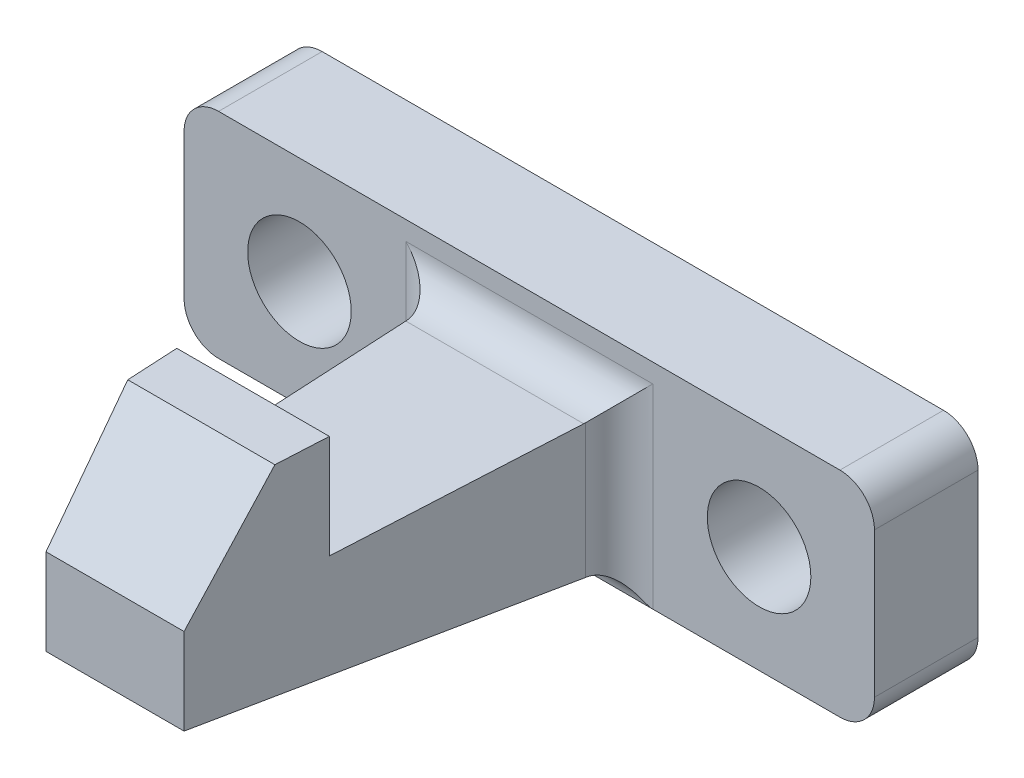
ISO-10303-21;
HEADER;
FILE_DESCRIPTION(('STEP AP214'),'2;1');
FILE_NAME('part.step','',(''),(''),'','','');
FILE_SCHEMA(('AUTOMOTIVE_DESIGN { 1 0 10303 214 1 1 1 1 }'));
ENDSEC;
DATA;
#1=APPLICATION_CONTEXT('core data for automotive mechanical design processes');
#2=APPLICATION_PROTOCOL_DEFINITION('international standard','automotive_design',2000,#1);
#3=PRODUCT_CONTEXT('',#1,'mechanical');
#4=PRODUCT('Part','Part','',(#3));
#5=PRODUCT_RELATED_PRODUCT_CATEGORY('part','',(#4));
#6=PRODUCT_DEFINITION_FORMATION('','',#4);
#7=PRODUCT_DEFINITION_CONTEXT('part definition',#1,'design');
#8=PRODUCT_DEFINITION('design','',#6,#7);
#9=PRODUCT_DEFINITION_SHAPE('','',#8);
#10=(LENGTH_UNIT() NAMED_UNIT(*) SI_UNIT(.MILLI.,.METRE.));
#11=(NAMED_UNIT(*) PLANE_ANGLE_UNIT() SI_UNIT($,.RADIAN.));
#12=(NAMED_UNIT(*) SI_UNIT($,.STERADIAN.) SOLID_ANGLE_UNIT());
#13=UNCERTAINTY_MEASURE_WITH_UNIT(LENGTH_MEASURE(1.E-05),#10,'distance_accuracy_value','');
#14=(GEOMETRIC_REPRESENTATION_CONTEXT(3) GLOBAL_UNCERTAINTY_ASSIGNED_CONTEXT((#13)) GLOBAL_UNIT_ASSIGNED_CONTEXT((#10,
#11,#12)) REPRESENTATION_CONTEXT('',''));
#15=CARTESIAN_POINT('',(0.,0.,0.));
#16=DIRECTION('',(0.,0.,1.));
#17=DIRECTION('',(1.,0.,0.));
#18=AXIS2_PLACEMENT_3D('',#15,#16,#17);
#19=CARTESIAN_POINT('',(10.,3.1,3.));
#20=DIRECTION('',(-1.,0.,0.));
#21=DIRECTION('',(0.,0.,1.));
#22=AXIS2_PLACEMENT_3D('',#19,#20,#21);
#23=PLANE('',#22);
#24=DIRECTION('',(0.,1.,0.));
#25=VECTOR('',#24,1.);
#26=CARTESIAN_POINT('',(10.,3.1,0.));
#27=LINE('',#26,#25);
#28=CARTESIAN_POINT('',(10.,-2.1,0.));
#29=VERTEX_POINT('',#28);
#30=CARTESIAN_POINT('',(10.,2.1,0.));
#31=VERTEX_POINT('',#30);
#32=EDGE_CURVE('E183',#29,#31,#27,.T.);
#33=ORIENTED_EDGE('',*,*,#32,.T.);
#34=DIRECTION('',(0.,0.,-1.));
#35=VECTOR('',#34,1.);
#36=CARTESIAN_POINT('',(10.,2.1,3.));
#37=LINE('',#36,#35);
#38=CARTESIAN_POINT('',(10.,2.1,3.));
#39=VERTEX_POINT('',#38);
#40=EDGE_CURVE('E420',#31,#39,#37,.F.);
#41=ORIENTED_EDGE('',*,*,#40,.T.);
#42=DIRECTION('',(0.,1.,0.));
#43=VECTOR('',#42,1.);
#44=CARTESIAN_POINT('',(10.,3.1,3.));
#45=LINE('',#44,#43);
#46=CARTESIAN_POINT('',(10.,-2.1,3.));
#47=VERTEX_POINT('',#46);
#48=EDGE_CURVE('E215',#47,#39,#45,.T.);
#49=ORIENTED_EDGE('',*,*,#48,.F.);
#50=DIRECTION('',(0.,0.,-1.));
#51=VECTOR('',#50,1.);
#52=CARTESIAN_POINT('',(10.,-2.1,3.));
#53=LINE('',#52,#51);
#54=EDGE_CURVE('E417',#47,#29,#53,.T.);
#55=ORIENTED_EDGE('',*,*,#54,.T.);
#56=EDGE_LOOP('',(#33,#41,#49,#55));
#57=FACE_BOUND('',#56,.T.);
#58=ADVANCED_FACE('F33',(#57),#23,.F.);
#59=CARTESIAN_POINT('',(-10.,3.1,3.));
#60=DIRECTION('',(0.,-1.,0.));
#61=DIRECTION('',(0.,0.,-1.));
#62=AXIS2_PLACEMENT_3D('',#59,#60,#61);
#63=PLANE('',#62);
#64=DIRECTION('',(-1.,0.,0.));
#65=VECTOR('',#64,1.);
#66=CARTESIAN_POINT('',(-10.,3.1,3.));
#67=LINE('',#66,#65);
#68=CARTESIAN_POINT('',(9.,3.1,3.));
#69=VERTEX_POINT('',#68);
#70=CARTESIAN_POINT('',(-9.,3.1,3.));
#71=VERTEX_POINT('',#70);
#72=EDGE_CURVE('E218',#69,#71,#67,.T.);
#73=ORIENTED_EDGE('',*,*,#72,.F.);
#74=DIRECTION('',(0.,0.,-1.));
#75=VECTOR('',#74,1.);
#76=CARTESIAN_POINT('',(9.,3.1,3.));
#77=LINE('',#76,#75);
#78=CARTESIAN_POINT('',(9.,3.1,0.));
#79=VERTEX_POINT('',#78);
#80=EDGE_CURVE('E404',#69,#79,#77,.T.);
#81=ORIENTED_EDGE('',*,*,#80,.T.);
#82=DIRECTION('',(-1.,0.,0.));
#83=VECTOR('',#82,1.);
#84=CARTESIAN_POINT('',(-10.,3.1,0.));
#85=LINE('',#84,#83);
#86=CARTESIAN_POINT('',(-9.,3.1,0.));
#87=VERTEX_POINT('',#86);
#88=EDGE_CURVE('E231',#79,#87,#85,.T.);
#89=ORIENTED_EDGE('',*,*,#88,.T.);
#90=DIRECTION('',(0.,0.,-1.));
#91=VECTOR('',#90,1.);
#92=CARTESIAN_POINT('',(-9.,3.1,3.));
#93=LINE('',#92,#91);
#94=EDGE_CURVE('E262',#87,#71,#93,.F.);
#95=ORIENTED_EDGE('',*,*,#94,.T.);
#96=EDGE_LOOP('',(#73,#81,#89,#95));
#97=FACE_BOUND('',#96,.T.);
#98=ADVANCED_FACE('F311',(#97),#63,.F.);
#99=CARTESIAN_POINT('',(-10.,3.1,3.));
#100=DIRECTION('',(1.,0.,0.));
#101=DIRECTION('',(0.,0.,-1.));
#102=AXIS2_PLACEMENT_3D('',#99,#100,#101);
#103=PLANE('',#102);
#104=DIRECTION('',(0.,-1.,0.));
#105=VECTOR('',#104,1.);
#106=CARTESIAN_POINT('',(-10.,3.1,0.));
#107=LINE('',#106,#105);
#108=CARTESIAN_POINT('',(-10.,2.1,0.));
#109=VERTEX_POINT('',#108);
#110=CARTESIAN_POINT('',(-10.,-2.1,0.));
#111=VERTEX_POINT('',#110);
#112=EDGE_CURVE('E234',#109,#111,#107,.T.);
#113=ORIENTED_EDGE('',*,*,#112,.T.);
#114=DIRECTION('',(0.,0.,-1.));
#115=VECTOR('',#114,1.);
#116=CARTESIAN_POINT('',(-10.,-2.1,3.));
#117=LINE('',#116,#115);
#118=CARTESIAN_POINT('',(-10.,-2.1,3.));
#119=VERTEX_POINT('',#118);
#120=EDGE_CURVE('E11',#111,#119,#117,.F.);
#121=ORIENTED_EDGE('',*,*,#120,.T.);
#122=DIRECTION('',(0.,-1.,0.));
#123=VECTOR('',#122,1.);
#124=CARTESIAN_POINT('',(-10.,3.1,3.));
#125=LINE('',#124,#123);
#126=CARTESIAN_POINT('',(-10.,2.1,3.));
#127=VERTEX_POINT('',#126);
#128=EDGE_CURVE('E222',#127,#119,#125,.T.);
#129=ORIENTED_EDGE('',*,*,#128,.F.);
#130=DIRECTION('',(0.,0.,-1.));
#131=VECTOR('',#130,1.);
#132=CARTESIAN_POINT('',(-10.,2.1,3.));
#133=LINE('',#132,#131);
#134=EDGE_CURVE('E41',#127,#109,#133,.T.);
#135=ORIENTED_EDGE('',*,*,#134,.T.);
#136=EDGE_LOOP('',(#113,#121,#129,#135));
#137=FACE_BOUND('',#136,.T.);
#138=ADVANCED_FACE('F317',(#137),#103,.F.);
#139=CARTESIAN_POINT('',(-10.,-3.1,3.));
#140=DIRECTION('',(0.,1.,0.));
#141=DIRECTION('',(0.,0.,1.));
#142=AXIS2_PLACEMENT_3D('',#139,#140,#141);
#143=PLANE('',#142);
#144=DIRECTION('',(1.,0.,0.));
#145=VECTOR('',#144,1.);
#146=CARTESIAN_POINT('',(-10.,-3.1,0.));
#147=LINE('',#146,#145);
#148=CARTESIAN_POINT('',(-9.,-3.1,0.));
#149=VERTEX_POINT('',#148);
#150=CARTESIAN_POINT('',(9.,-3.1,0.));
#151=VERTEX_POINT('',#150);
#152=EDGE_CURVE('E219',#149,#151,#147,.T.);
#153=ORIENTED_EDGE('',*,*,#152,.T.);
#154=DIRECTION('',(0.,0.,-1.));
#155=VECTOR('',#154,1.);
#156=CARTESIAN_POINT('',(9.,-3.1,3.));
#157=LINE('',#156,#155);
#158=CARTESIAN_POINT('',(9.,-3.1,3.));
#159=VERTEX_POINT('',#158);
#160=EDGE_CURVE('E431',#151,#159,#157,.F.);
#161=ORIENTED_EDGE('',*,*,#160,.T.);
#162=DIRECTION('',(1.,0.,0.));
#163=VECTOR('',#162,1.);
#164=CARTESIAN_POINT('',(-10.,-3.1,3.));
#165=LINE('',#164,#163);
#166=CARTESIAN_POINT('',(3.57785791811138,-3.1,3.));
#167=VERTEX_POINT('',#166);
#168=EDGE_CURVE('E224',#167,#159,#165,.T.);
#169=ORIENTED_EDGE('',*,*,#168,.F.);
#170=CARTESIAN_POINT('',(-3.57785791811137,-3.1,3.));
#171=VERTEX_POINT('',#170);
#172=EDGE_CURVE('E228',#171,#167,#165,.T.);
#173=ORIENTED_EDGE('',*,*,#172,.F.);
#174=CARTESIAN_POINT('',(-9.,-3.1,3.));
#175=VERTEX_POINT('',#174);
#176=EDGE_CURVE('E225',#175,#171,#165,.T.);
#177=ORIENTED_EDGE('',*,*,#176,.F.);
#178=DIRECTION('',(0.,0.,-1.));
#179=VECTOR('',#178,1.);
#180=CARTESIAN_POINT('',(-9.,-3.1,3.));
#181=LINE('',#180,#179);
#182=EDGE_CURVE('E428',#175,#149,#181,.T.);
#183=ORIENTED_EDGE('',*,*,#182,.T.);
#184=EDGE_LOOP('',(#153,#161,#169,#173,#177,#183));
#185=FACE_BOUND('',#184,.T.);
#186=ADVANCED_FACE('F435',(#185),#143,.F.);
#187=CARTESIAN_POINT('',(0.,0.,3.));
#188=DIRECTION('',(0.,0.,1.));
#189=DIRECTION('',(1.,0.,0.));
#190=AXIS2_PLACEMENT_3D('',#187,#188,#189);
#191=PLANE('',#190);
#192=CARTESIAN_POINT('',(6.65790951,0.,3.));
#193=DIRECTION('',(0.,0.,-1.));
#194=DIRECTION('',(-1.,0.,0.));
#195=AXIS2_PLACEMENT_3D('',#192,#193,#194);
#196=CIRCLE('',#195,1.5);
#197=CARTESIAN_POINT('',(8.15790951,0.,3.));
#198=VERTEX_POINT('',#197);
#199=EDGE_CURVE('E375',#198,#198,#196,.T.);
#200=ORIENTED_EDGE('',*,*,#199,.T.);
#201=EDGE_LOOP('',(#200));
#202=FACE_BOUND('',#201,.T.);
#203=CARTESIAN_POINT('',(-6.65790951,0.,3.));
#204=DIRECTION('',(0.,0.,1.));
#205=DIRECTION('',(1.,0.,0.));
#206=AXIS2_PLACEMENT_3D('',#203,#204,#205);
#207=CIRCLE('',#206,1.5);
#208=CARTESIAN_POINT('',(-5.15790951,0.,3.));
#209=VERTEX_POINT('',#208);
#210=EDGE_CURVE('E372',#209,#209,#207,.T.);
#211=ORIENTED_EDGE('',*,*,#210,.F.);
#212=EDGE_LOOP('',(#211));
#213=FACE_BOUND('',#212,.T.);
#214=ORIENTED_EDGE('',*,*,#48,.T.);
#215=CARTESIAN_POINT('',(9.,2.1,3.));
#216=DIRECTION('',(0.,0.,1.));
#217=DIRECTION('',(1.,0.,0.));
#218=AXIS2_PLACEMENT_3D('',#215,#216,#217);
#219=CIRCLE('',#218,1.);
#220=EDGE_CURVE('E426',#39,#69,#219,.T.);
#221=ORIENTED_EDGE('',*,*,#220,.T.);
#222=ORIENTED_EDGE('',*,*,#72,.T.);
#223=CARTESIAN_POINT('',(-9.,2.1,3.));
#224=DIRECTION('',(0.,0.,1.));
#225=DIRECTION('',(1.,0.,0.));
#226=AXIS2_PLACEMENT_3D('',#223,#224,#225);
#227=CIRCLE('',#226,1.);
#228=EDGE_CURVE('E408',#71,#127,#227,.T.);
#229=ORIENTED_EDGE('',*,*,#228,.T.);
#230=ORIENTED_EDGE('',*,*,#128,.T.);
#231=CARTESIAN_POINT('',(-9.,-2.1,3.));
#232=DIRECTION('',(0.,0.,1.));
#233=DIRECTION('',(1.,0.,0.));
#234=AXIS2_PLACEMENT_3D('',#231,#232,#233);
#235=CIRCLE('',#234,1.);
#236=EDGE_CURVE('E48',#119,#175,#235,.T.);
#237=ORIENTED_EDGE('',*,*,#236,.T.);
#238=ORIENTED_EDGE('',*,*,#176,.T.);
#239=DIRECTION('',(0.,1.,0.));
#240=VECTOR('',#239,1.);
#241=CARTESIAN_POINT('',(-3.57785791811137,1.55,3.));
#242=LINE('',#241,#240);
#243=CARTESIAN_POINT('',(-3.57785791811137,2.55,3.));
#244=VERTEX_POINT('',#243);
#245=EDGE_CURVE('E227',#171,#244,#242,.T.);
#246=ORIENTED_EDGE('',*,*,#245,.T.);
#247=DIRECTION('',(1.,0.,0.));
#248=VECTOR('',#247,1.);
#249=CARTESIAN_POINT('',(2.62889335139649,2.55,3.));
#250=LINE('',#249,#248);
#251=CARTESIAN_POINT('',(3.57785791811137,2.55,3.));
#252=VERTEX_POINT('',#251);
#253=EDGE_CURVE('E239',#244,#252,#250,.T.);
#254=ORIENTED_EDGE('',*,*,#253,.T.);
#255=DIRECTION('',(0.,-1.,0.));
#256=VECTOR('',#255,1.);
#257=CARTESIAN_POINT('',(3.57785791811137,-2.44999999999998,3.));
#258=LINE('',#257,#256);
#259=EDGE_CURVE('E242',#252,#167,#258,.T.);
#260=ORIENTED_EDGE('',*,*,#259,.T.);
#261=ORIENTED_EDGE('',*,*,#168,.T.);
#262=CARTESIAN_POINT('',(9.,-2.1,3.));
#263=DIRECTION('',(0.,0.,1.));
#264=DIRECTION('',(1.,0.,0.));
#265=AXIS2_PLACEMENT_3D('',#262,#263,#264);
#266=CIRCLE('',#265,1.);
#267=EDGE_CURVE('E424',#159,#47,#266,.T.);
#268=ORIENTED_EDGE('',*,*,#267,.T.);
#269=EDGE_LOOP('',(#214,#221,#222,#229,#230,#237,#238,#246,#254,#260,#261,#268));
#270=FACE_BOUND('',#269,.T.);
#271=ADVANCED_FACE('F346',(#202,#213,#270),#191,.T.);
#272=CARTESIAN_POINT('',(0.,0.,0.));
#273=DIRECTION('',(0.,0.,1.));
#274=DIRECTION('',(1.,0.,0.));
#275=AXIS2_PLACEMENT_3D('',#272,#273,#274);
#276=PLANE('',#275);
#277=CARTESIAN_POINT('',(6.65790951,0.,0.));
#278=DIRECTION('',(0.,0.,1.));
#279=DIRECTION('',(1.,0.,0.));
#280=AXIS2_PLACEMENT_3D('',#277,#278,#279);
#281=CIRCLE('',#280,1.5);
#282=CARTESIAN_POINT('',(8.15790951,0.,0.));
#283=VERTEX_POINT('',#282);
#284=EDGE_CURVE('E376',#283,#283,#281,.T.);
#285=ORIENTED_EDGE('',*,*,#284,.T.);
#286=EDGE_LOOP('',(#285));
#287=FACE_BOUND('',#286,.T.);
#288=CARTESIAN_POINT('',(-6.65790951,0.,0.));
#289=DIRECTION('',(0.,0.,1.));
#290=DIRECTION('',(1.,0.,0.));
#291=AXIS2_PLACEMENT_3D('',#288,#289,#290);
#292=CIRCLE('',#291,1.5);
#293=CARTESIAN_POINT('',(-5.15790951,0.,0.));
#294=VERTEX_POINT('',#293);
#295=EDGE_CURVE('E266',#294,#294,#292,.F.);
#296=ORIENTED_EDGE('',*,*,#295,.F.);
#297=EDGE_LOOP('',(#296));
#298=FACE_BOUND('',#297,.T.);
#299=ORIENTED_EDGE('',*,*,#88,.F.);
#300=CARTESIAN_POINT('',(9.,2.1,0.));
#301=DIRECTION('',(0.,0.,1.));
#302=DIRECTION('',(1.,0.,0.));
#303=AXIS2_PLACEMENT_3D('',#300,#301,#302);
#304=CIRCLE('',#303,1.);
#305=EDGE_CURVE('E397',#79,#31,#304,.F.);
#306=ORIENTED_EDGE('',*,*,#305,.T.);
#307=ORIENTED_EDGE('',*,*,#32,.F.);
#308=CARTESIAN_POINT('',(9.,-2.1,0.));
#309=DIRECTION('',(0.,0.,1.));
#310=DIRECTION('',(1.,0.,0.));
#311=AXIS2_PLACEMENT_3D('',#308,#309,#310);
#312=CIRCLE('',#311,1.);
#313=EDGE_CURVE('E414',#29,#151,#312,.F.);
#314=ORIENTED_EDGE('',*,*,#313,.T.);
#315=ORIENTED_EDGE('',*,*,#152,.F.);
#316=CARTESIAN_POINT('',(-9.,-2.1,0.));
#317=DIRECTION('',(0.,0.,1.));
#318=DIRECTION('',(1.,0.,0.));
#319=AXIS2_PLACEMENT_3D('',#316,#317,#318);
#320=CIRCLE('',#319,1.);
#321=EDGE_CURVE('E412',#149,#111,#320,.F.);
#322=ORIENTED_EDGE('',*,*,#321,.T.);
#323=ORIENTED_EDGE('',*,*,#112,.F.);
#324=CARTESIAN_POINT('',(-9.,2.1,0.));
#325=DIRECTION('',(0.,0.,1.));
#326=DIRECTION('',(1.,0.,0.));
#327=AXIS2_PLACEMENT_3D('',#324,#325,#326);
#328=CIRCLE('',#327,1.);
#329=EDGE_CURVE('E399',#109,#87,#328,.F.);
#330=ORIENTED_EDGE('',*,*,#329,.T.);
#331=EDGE_LOOP('',(#299,#306,#307,#314,#315,#322,#323,#330));
#332=FACE_BOUND('',#331,.T.);
#333=ADVANCED_FACE('F389',(#287,#298,#332),#276,.F.);
#334=CARTESIAN_POINT('',(0.,1.55,-491.));
#335=DIRECTION('',(0.,1.,0.));
#336=DIRECTION('',(1.,0.,0.));
#337=AXIS2_PLACEMENT_3D('',#334,#335,#336);
#338=PLANE('',#337);
#339=DIRECTION('',(0.0523359562429438,0.,-0.998629534754574));
#340=VECTOR('',#339,1.);
#341=CARTESIAN_POINT('',(2.,1.55,15.));
#342=LINE('',#341,#340);
#343=CARTESIAN_POINT('',(2.20963111713216,1.55,11.));
#344=VERTEX_POINT('',#343);
#345=CARTESIAN_POINT('',(2.57648557211345,1.55,3.99999999999999));
#346=VERTEX_POINT('',#345);
#347=EDGE_CURVE('E197',#344,#346,#342,.T.);
#348=ORIENTED_EDGE('',*,*,#347,.T.);
#349=DIRECTION('',(1.,0.,0.));
#350=VECTOR('',#349,1.);
#351=CARTESIAN_POINT('',(-2.62889335139649,1.55,4.));
#352=LINE('',#351,#350);
#353=CARTESIAN_POINT('',(-2.57648557211345,1.55,3.99999999999999));
#354=VERTEX_POINT('',#353);
#355=EDGE_CURVE('E244',#346,#354,#352,.F.);
#356=ORIENTED_EDGE('',*,*,#355,.T.);
#357=DIRECTION('',(0.0523359562429438,0.,0.998629534754574));
#358=VECTOR('',#357,1.);
#359=CARTESIAN_POINT('',(-2.,1.55,15.));
#360=LINE('',#359,#358);
#361=CARTESIAN_POINT('',(-2.20963111713216,1.55,11.));
#362=VERTEX_POINT('',#361);
#363=EDGE_CURVE('E205',#354,#362,#360,.T.);
#364=ORIENTED_EDGE('',*,*,#363,.T.);
#365=DIRECTION('',(1.,0.,0.));
#366=VECTOR('',#365,1.);
#367=CARTESIAN_POINT('',(0.,1.55,11.));
#368=LINE('',#367,#366);
#369=EDGE_CURVE('E180',#362,#344,#368,.T.);
#370=ORIENTED_EDGE('',*,*,#369,.T.);
#371=EDGE_LOOP('',(#348,#356,#364,#370));
#372=FACE_BOUND('',#371,.T.);
#373=ADVANCED_FACE('F334',(#372),#338,.T.);
#374=CARTESIAN_POINT('',(-2.,-0.95,15.));
#375=DIRECTION('',(-0.998629534754574,0.,0.0523359562429438));
#376=DIRECTION('',(-0.0523359562429438,0.,-0.998629534754574));
#377=AXIS2_PLACEMENT_3D('',#374,#375,#376);
#378=PLANE('',#377);
#379=CARTESIAN_POINT('',(-2.57648557211345,2.55,4.));
#380=DIRECTION('',(-0.998629534754574,0.,0.0523359562429438));
#381=DIRECTION('',(-0.0523359562429438,0.,-0.998629534754574));
#382=AXIS2_PLACEMENT_3D('',#379,#380,#381);
#383=ELLIPSE('',#382,1.00137234599792,1.);
#384=CARTESIAN_POINT('',(-2.5792283833568,1.55137046524543,3.94766404375706));
#385=VERTEX_POINT('',#384);
#386=EDGE_CURVE('E255',#354,#385,#383,.F.);
#387=ORIENTED_EDGE('',*,*,#386,.T.);
#388=DIRECTION('',(0.,1.,0.));
#389=VECTOR('',#388,1.);
#390=CARTESIAN_POINT('',(-2.5792283833568,-2.44999999999998,3.94766404375706));
#391=LINE('',#390,#389);
#392=CARTESIAN_POINT('',(-2.5792283833568,-2.33154199453035,3.94766404375706));
#393=VERTEX_POINT('',#392);
#394=EDGE_CURVE('E249',#385,#393,#391,.F.);
#395=ORIENTED_EDGE('',*,*,#394,.T.);
#396=DIRECTION('',(-0.0519329057553304,-0.123867359163544,-0.990938873308368));
#397=VECTOR('',#396,1.);
#398=CARTESIAN_POINT('',(-2.,-0.95,15.));
#399=LINE('',#398,#397);
#400=CARTESIAN_POINT('',(-2.,-0.95,15.));
#401=VERTEX_POINT('',#400);
#402=EDGE_CURVE('E212',#401,#393,#399,.T.);
#403=ORIENTED_EDGE('',*,*,#402,.F.);
#404=DIRECTION('',(0.,1.,0.));
#405=VECTOR('',#404,1.);
#406=CARTESIAN_POINT('',(-2.,-0.95,15.));
#407=LINE('',#406,#405);
#408=CARTESIAN_POINT('',(-2.,1.55,15.));
#409=VERTEX_POINT('',#408);
#410=EDGE_CURVE('E192',#401,#409,#407,.T.);
#411=ORIENTED_EDGE('',*,*,#410,.T.);
#412=DIRECTION('',(0.0335317755777286,-0.767789271817039,0.639824393180867));
#413=VECTOR('',#412,1.);
#414=CARTESIAN_POINT('',(-1.93563665611611,0.0762490852066456,16.2281257623278));
#415=LINE('',#414,#413);
#416=CARTESIAN_POINT('',(-2.1310194482076,4.55,12.5));
#417=VERTEX_POINT('',#416);
#418=EDGE_CURVE('E190',#417,#409,#415,.T.);
#419=ORIENTED_EDGE('',*,*,#418,.F.);
#420=DIRECTION('',(-0.0523359562429438,0.,-0.998629534754574));
#421=VECTOR('',#420,1.);
#422=CARTESIAN_POINT('',(-2.,4.55,15.));
#423=LINE('',#422,#421);
#424=CARTESIAN_POINT('',(-2.20963111713216,4.55,11.));
#425=VERTEX_POINT('',#424);
#426=EDGE_CURVE('E168',#417,#425,#423,.T.);
#427=ORIENTED_EDGE('',*,*,#426,.T.);
#428=DIRECTION('',(0.,1.,0.));
#429=VECTOR('',#428,1.);
#430=CARTESIAN_POINT('',(-2.20963111713216,-0.95,11.));
#431=LINE('',#430,#429);
#432=EDGE_CURVE('E173',#362,#425,#431,.T.);
#433=ORIENTED_EDGE('',*,*,#432,.F.);
#434=ORIENTED_EDGE('',*,*,#363,.F.);
#435=EDGE_LOOP('',(#387,#395,#403,#411,#419,#427,#433,#434));
#436=FACE_BOUND('',#435,.T.);
#437=ADVANCED_FACE('F187',(#436),#378,.T.);
#438=CARTESIAN_POINT('',(0.,-0.95,15.));
#439=DIRECTION('',(0.,0.,1.));
#440=DIRECTION('',(0.,1.,0.));
#441=AXIS2_PLACEMENT_3D('',#438,#439,#440);
#442=PLANE('',#441);
#443=ORIENTED_EDGE('',*,*,#410,.F.);
#444=DIRECTION('',(-1.,0.,0.));
#445=VECTOR('',#444,1.);
#446=CARTESIAN_POINT('',(0.,-0.95,15.));
#447=LINE('',#446,#445);
#448=CARTESIAN_POINT('',(2.,-0.95,15.));
#449=VERTEX_POINT('',#448);
#450=EDGE_CURVE('E211',#449,#401,#447,.T.);
#451=ORIENTED_EDGE('',*,*,#450,.F.);
#452=DIRECTION('',(0.,1.,0.));
#453=VECTOR('',#452,1.);
#454=CARTESIAN_POINT('',(2.,-0.95,15.));
#455=LINE('',#454,#453);
#456=CARTESIAN_POINT('',(2.,1.55,15.));
#457=VERTEX_POINT('',#456);
#458=EDGE_CURVE('E191',#449,#457,#455,.T.);
#459=ORIENTED_EDGE('',*,*,#458,.T.);
#460=DIRECTION('',(1.,0.,0.));
#461=VECTOR('',#460,1.);
#462=CARTESIAN_POINT('',(0.,1.55,15.));
#463=LINE('',#462,#461);
#464=EDGE_CURVE('E361',#409,#457,#463,.T.);
#465=ORIENTED_EDGE('',*,*,#464,.F.);
#466=EDGE_LOOP('',(#443,#451,#459,#465));
#467=FACE_BOUND('',#466,.T.);
#468=ADVANCED_FACE('F359',(#467),#442,.T.);
#469=CARTESIAN_POINT('',(0.,-0.95,15.));
#470=DIRECTION('',(0.,-0.992277876713668,0.124034734589207));
#471=DIRECTION('',(0.,0.124034734589207,0.992277876713668));
#472=AXIS2_PLACEMENT_3D('',#469,#470,#471);
#473=PLANE('',#472);
#474=CARTESIAN_POINT('',(-3.57785791811137,-2.32499999999998,4.));
#475=DIRECTION('',(0.,-0.992277876713668,0.124034734589207));
#476=DIRECTION('',(0.,-0.124034734589207,-0.992277876713668));
#477=AXIS2_PLACEMENT_3D('',#474,#475,#476);
#478=ELLIPSE('',#477,1.00778221853732,1.);
#479=CARTESIAN_POINT('',(-2.58953287886823,-2.34404501936408,3.84763984508725));
#480=VERTEX_POINT('',#479);
#481=EDGE_CURVE('E259',#393,#480,#478,.F.);
#482=ORIENTED_EDGE('',*,*,#481,.T.);
#483=DIRECTION('',(1.,0.,0.));
#484=VECTOR('',#483,1.);
#485=CARTESIAN_POINT('',(2.62889335139649,-2.34404501936408,3.84763984508725));
#486=LINE('',#485,#484);
#487=CARTESIAN_POINT('',(2.58953287886823,-2.34404501936408,3.84763984508725));
#488=VERTEX_POINT('',#487);
#489=EDGE_CURVE('E251',#480,#488,#486,.T.);
#490=ORIENTED_EDGE('',*,*,#489,.T.);
#491=CARTESIAN_POINT('',(3.57785791811137,-2.32499999999998,4.));
#492=DIRECTION('',(0.,-0.992277876713668,0.124034734589207));
#493=DIRECTION('',(0.,0.124034734589207,0.992277876713668));
#494=AXIS2_PLACEMENT_3D('',#491,#492,#493);
#495=ELLIPSE('',#494,1.00778221853732,1.);
#496=CARTESIAN_POINT('',(2.5792283833568,-2.33154199453035,3.94766404375706));
#497=VERTEX_POINT('',#496);
#498=EDGE_CURVE('E257',#488,#497,#495,.F.);
#499=ORIENTED_EDGE('',*,*,#498,.T.);
#500=DIRECTION('',(-0.0519329057553304,0.123867359163544,0.990938873308368));
#501=VECTOR('',#500,1.);
#502=CARTESIAN_POINT('',(2.,-0.95,15.));
#503=LINE('',#502,#501);
#504=EDGE_CURVE('E195',#497,#449,#503,.T.);
#505=ORIENTED_EDGE('',*,*,#504,.T.);
#506=ORIENTED_EDGE('',*,*,#450,.T.);
#507=ORIENTED_EDGE('',*,*,#402,.T.);
#508=EDGE_LOOP('',(#482,#490,#499,#505,#506,#507));
#509=FACE_BOUND('',#508,.T.);
#510=ADVANCED_FACE('F353',(#509),#473,.T.);
#511=CARTESIAN_POINT('',(2.,-0.95,15.));
#512=DIRECTION('',(0.998629534754574,0.,0.0523359562429438));
#513=DIRECTION('',(-0.0523359562429438,0.,0.998629534754574));
#514=AXIS2_PLACEMENT_3D('',#511,#512,#513);
#515=PLANE('',#514);
#516=ORIENTED_EDGE('',*,*,#504,.F.);
#517=DIRECTION('',(0.,-1.,0.));
#518=VECTOR('',#517,1.);
#519=CARTESIAN_POINT('',(2.5792283833568,1.55,3.94766404375706));
#520=LINE('',#519,#518);
#521=CARTESIAN_POINT('',(2.5792283833568,1.55137046524543,3.94766404375706));
#522=VERTEX_POINT('',#521);
#523=EDGE_CURVE('E247',#497,#522,#520,.F.);
#524=ORIENTED_EDGE('',*,*,#523,.T.);
#525=CARTESIAN_POINT('',(2.57648557211345,2.55,4.));
#526=DIRECTION('',(0.998629534754574,0.,0.0523359562429438));
#527=DIRECTION('',(-0.0523359562429438,0.,0.998629534754574));
#528=AXIS2_PLACEMENT_3D('',#525,#526,#527);
#529=ELLIPSE('',#528,1.00137234599792,1.);
#530=EDGE_CURVE('E253',#522,#346,#529,.F.);
#531=ORIENTED_EDGE('',*,*,#530,.T.);
#532=ORIENTED_EDGE('',*,*,#347,.F.);
#533=DIRECTION('',(0.,1.,0.));
#534=VECTOR('',#533,1.);
#535=CARTESIAN_POINT('',(2.20963111713216,1.55,11.));
#536=LINE('',#535,#534);
#537=CARTESIAN_POINT('',(2.20963111713216,4.55,11.));
#538=VERTEX_POINT('',#537);
#539=EDGE_CURVE('E204',#344,#538,#536,.T.);
#540=ORIENTED_EDGE('',*,*,#539,.T.);
#541=DIRECTION('',(-0.0523359562429438,0.,0.998629534754574));
#542=VECTOR('',#541,1.);
#543=CARTESIAN_POINT('',(2.,4.55,15.));
#544=LINE('',#543,#542);
#545=CARTESIAN_POINT('',(2.1310194482076,4.55,12.5));
#546=VERTEX_POINT('',#545);
#547=EDGE_CURVE('E170',#538,#546,#544,.T.);
#548=ORIENTED_EDGE('',*,*,#547,.T.);
#549=DIRECTION('',(0.0335317755777286,0.767789271817039,-0.639824393180867));
#550=VECTOR('',#549,1.);
#551=CARTESIAN_POINT('',(1.93563665611611,0.0762490852066456,16.2281257623278));
#552=LINE('',#551,#550);
#553=EDGE_CURVE('E174',#457,#546,#552,.T.);
#554=ORIENTED_EDGE('',*,*,#553,.F.);
#555=ORIENTED_EDGE('',*,*,#458,.F.);
#556=EDGE_LOOP('',(#516,#524,#531,#532,#540,#548,#554,#555));
#557=FACE_BOUND('',#556,.T.);
#558=ADVANCED_FACE('F338',(#557),#515,.T.);
#559=CARTESIAN_POINT('',(0.,1.55,15.));
#560=DIRECTION('',(0.,0.64018439966448,0.768221279597375));
#561=DIRECTION('',(0.,0.768221279597375,-0.64018439966448));
#562=AXIS2_PLACEMENT_3D('',#559,#560,#561);
#563=PLANE('',#562);
#564=DIRECTION('',(-1.,0.,0.));
#565=VECTOR('',#564,1.);
#566=CARTESIAN_POINT('',(0.,4.55,12.5));
#567=LINE('',#566,#565);
#568=EDGE_CURVE('E201',#546,#417,#567,.T.);
#569=ORIENTED_EDGE('',*,*,#568,.T.);
#570=ORIENTED_EDGE('',*,*,#418,.T.);
#571=ORIENTED_EDGE('',*,*,#464,.T.);
#572=ORIENTED_EDGE('',*,*,#553,.T.);
#573=EDGE_LOOP('',(#569,#570,#571,#572));
#574=FACE_BOUND('',#573,.T.);
#575=ADVANCED_FACE('F365',(#574),#563,.T.);
#576=CARTESIAN_POINT('',(0.,1.55,11.));
#577=DIRECTION('',(0.,0.,-1.));
#578=DIRECTION('',(0.,-1.,0.));
#579=AXIS2_PLACEMENT_3D('',#576,#577,#578);
#580=PLANE('',#579);
#581=DIRECTION('',(1.,0.,0.));
#582=VECTOR('',#581,1.);
#583=CARTESIAN_POINT('',(0.,4.55,11.));
#584=LINE('',#583,#582);
#585=EDGE_CURVE('E164',#425,#538,#584,.T.);
#586=ORIENTED_EDGE('',*,*,#585,.T.);
#587=ORIENTED_EDGE('',*,*,#539,.F.);
#588=ORIENTED_EDGE('',*,*,#369,.F.);
#589=ORIENTED_EDGE('',*,*,#432,.T.);
#590=EDGE_LOOP('',(#586,#587,#588,#589));
#591=FACE_BOUND('',#590,.T.);
#592=ADVANCED_FACE('F178',(#591),#580,.T.);
#593=CARTESIAN_POINT('',(0.,4.55,11.));
#594=DIRECTION('',(0.,-1.,0.));
#595=DIRECTION('',(-1.,0.,0.));
#596=AXIS2_PLACEMENT_3D('',#593,#594,#595);
#597=PLANE('',#596);
#598=ORIENTED_EDGE('',*,*,#568,.F.);
#599=ORIENTED_EDGE('',*,*,#547,.F.);
#600=ORIENTED_EDGE('',*,*,#585,.F.);
#601=ORIENTED_EDGE('',*,*,#426,.F.);
#602=EDGE_LOOP('',(#598,#599,#600,#601));
#603=FACE_BOUND('',#602,.T.);
#604=ADVANCED_FACE('F166',(#603),#597,.F.);
#605=CARTESIAN_POINT('',(0.,-3.33632289607774,3.97167457967646));
#606=DIRECTION('',(-1.,0.,0.));
#607=DIRECTION('',(0.,0.,1.));
#608=AXIS2_PLACEMENT_3D('',#605,#606,#607);
#609=CYLINDRICAL_SURFACE('',#608,1.);
#610=ORIENTED_EDGE('',*,*,#489,.F.);
#611=CARTESIAN_POINT('',(-2.58953287886823,-2.34404501936408,3.84763984508725));
#612=CARTESIAN_POINT('',(-2.5932608022886,-2.34706718376824,3.82343575080886));
#613=CARTESIAN_POINT('',(-2.59786498958766,-2.3509624772002,3.79949848477284));
#614=CARTESIAN_POINT('',(-2.60870579933451,-2.3603744062921,3.75235690778281));
#615=CARTESIAN_POINT('',(-2.61494015342237,-2.36588879030455,3.7291516281682));
#616=CARTESIAN_POINT('',(-2.63577841116269,-2.38455598176027,3.66131970156889));
#617=CARTESIAN_POINT('',(-2.65260238966943,-2.39990286689116,3.61795274714438));
#618=CARTESIAN_POINT('',(-2.69096538702395,-2.43520340047726,3.53580887874192));
#619=CARTESIAN_POINT('',(-2.712479221654,-2.45513247303491,3.49700909063369));
#620=CARTESIAN_POINT('',(-2.75933042761801,-2.49861985496689,3.42388944608061));
#621=CARTESIAN_POINT('',(-2.7846788574749,-2.52218866515631,3.3895831001843));
#622=CARTESIAN_POINT('',(-2.85273913943408,-2.58536630521719,3.30838892020933));
#623=CARTESIAN_POINT('',(-2.89747432309533,-2.62680045768724,3.26461585246287));
#624=CARTESIAN_POINT('',(-2.99197333900519,-2.71331904574467,3.18729986091387));
#625=CARTESIAN_POINT('',(-3.04174738756446,-2.75841085893878,3.15377829826489));
#626=CARTESIAN_POINT('',(-3.13804556257066,-2.84324951500363,3.10047137493771));
#627=CARTESIAN_POINT('',(-3.18400790672046,-2.88283262483845,3.07940396963488));
#628=CARTESIAN_POINT('',(-3.25584203671609,-2.94090427044848,3.05292444854685));
#629=CARTESIAN_POINT('',(-3.28026788443308,-2.96004386469066,3.04495167138508));
#630=CARTESIAN_POINT('',(-3.33044861482721,-2.99717006842816,3.03073657838423));
#631=CARTESIAN_POINT('',(-3.35620138016252,-3.01515841801944,3.02449160111846));
#632=CARTESIAN_POINT('',(-3.40026394633105,-3.04252603893493,3.01573933739789));
#633=CARTESIAN_POINT('',(-3.4179684532479,-3.05269376232792,3.01269232604209));
#634=CARTESIAN_POINT('',(-3.45439930343806,-3.07095792245285,3.00748094331895));
#635=CARTESIAN_POINT('',(-3.47311515590753,-3.07907197988882,3.00530896147396));
#636=CARTESIAN_POINT('',(-3.5060944364967,-3.08995497244936,3.00248598681267));
#637=CARTESIAN_POINT('',(-3.52003298966855,-3.09359538446402,3.00157497627478));
#638=CARTESIAN_POINT('',(-3.54856401842932,-3.09866686480875,3.00032329652231));
#639=CARTESIAN_POINT('',(-3.5631636020073,-3.10005906662212,2.99999265226656));
#640=CARTESIAN_POINT('',(-3.57785791811139,-3.09999999999995,3.));
#641=B_SPLINE_CURVE_WITH_KNOTS('',3,(#611,#612,#613,#614,#615,#616,#617,#618,#619,#620,#621,
#622,#623,#624,#625,#626,#627,#628,#629,#630,#631,#632,#633,#634,#635,#636,#637,#638,#639,#640),
.UNSPECIFIED.,.F.,.F.,(4,2,2,2,2,2,2,2,2,2,2,2,2,2,4),(0.,0.0739553141920871,0.147808262965156,
0.293933467134254,0.439292513375402,0.585079044254172,0.809021422380531,1.03342730083907,
1.22556622177697,1.32163099446886,1.41754695877416,1.47939459139296,1.54069205366269,
1.58381789871115,1.62768160679037),.UNSPECIFIED.);
#642=EDGE_CURVE('E207',#171,#480,#641,.F.);
#643=ORIENTED_EDGE('',*,*,#642,.F.);
#644=ORIENTED_EDGE('',*,*,#172,.T.);
#645=CARTESIAN_POINT('',(3.57785791811137,-3.1,3.));
#646=CARTESIAN_POINT('',(3.56092064440618,-3.10009347004327,2.9999888790582));
#647=CARTESIAN_POINT('',(3.54415676472511,-3.09823179115131,3.00042862054663));
#648=CARTESIAN_POINT('',(3.51160981273745,-3.09160962566481,3.00207029103217));
#649=CARTESIAN_POINT('',(3.49581325579701,-3.08691406774798,3.00325517250939));
#650=CARTESIAN_POINT('',(3.44882266404657,-3.06955833226361,3.00784400752515));
#651=CARTESIAN_POINT('',(3.4189902417902,-3.05372435875981,3.01226990178422));
#652=CARTESIAN_POINT('',(3.36131324640548,-3.01867059870154,3.02327960797424));
#653=CARTESIAN_POINT('',(3.33351664485284,-2.9993927049451,3.02990246035294));
#654=CARTESIAN_POINT('',(3.27732093444236,-2.95791182650657,3.04575034991234));
#655=CARTESIAN_POINT('',(3.24904899541547,-2.93559811620231,3.05514015374102));
#656=CARTESIAN_POINT('',(3.19379005105868,-2.89046407271609,3.07622219267195));
#657=CARTESIAN_POINT('',(3.16680416307909,-2.86764332336358,3.08791638616954));
#658=CARTESIAN_POINT('',(3.08781440773715,-2.79956475384083,3.12634223123673));
#659=CARTESIAN_POINT('',(3.03736967566646,-2.75436325355987,3.1565342461027));
#660=CARTESIAN_POINT('',(2.94596600956433,-2.67134792088449,3.2231064421256));
#661=CARTESIAN_POINT('',(2.90456522423623,-2.63325273906559,3.25852869233818));
#662=CARTESIAN_POINT('',(2.82644758853983,-2.56101393863358,3.33782559248551));
#663=CARTESIAN_POINT('',(2.78973128634339,-2.52687078252445,3.38170123011907));
#664=CARTESIAN_POINT('',(2.73132689794787,-2.47261678455572,3.4658605970328));
#665=CARTESIAN_POINT('',(2.70818563123864,-2.45114012570672,3.5042510330239));
#666=CARTESIAN_POINT('',(2.66665443506038,-2.41279411693729,3.5855393386908));
#667=CARTESIAN_POINT('',(2.64824862487028,-2.39590935656682,3.62842144585079));
#668=CARTESIAN_POINT('',(2.6231632208881,-2.37322193756125,3.70096547376369));
#669=CARTESIAN_POINT('',(2.61468508349603,-2.36564594544563,3.72946214918603));
#670=CARTESIAN_POINT('',(2.60018673112441,-2.35293443948712,3.78770813937303));
#671=CARTESIAN_POINT('',(2.59417522728843,-2.34780756463902,3.81746149119795));
#672=CARTESIAN_POINT('',(2.58953287886823,-2.34404501936408,3.84763984508725));
#673=B_SPLINE_CURVE_WITH_KNOTS('',3,(#645,#646,#647,#648,#649,#650,#651,#652,#653,#654,#655,
#656,#657,#658,#659,#660,#661,#662,#663,#664,#665,#666,#667,#668,#669,#670,#671,#672),
.UNSPECIFIED.,.F.,.F.,(4,2,2,2,2,2,2,2,2,2,2,2,2,4),(0.,0.0504323152379962,0.099750824658561,
0.201166256233197,0.304490125331236,0.416011648439366,0.527628360550044,0.749264666297249,
0.948068096916075,1.14689476994772,1.29548661858843,1.4435734591196,1.53541223333322,
1.62757260954538),.UNSPECIFIED.);
#674=EDGE_CURVE('E269',#488,#167,#673,.F.);
#675=ORIENTED_EDGE('',*,*,#674,.F.);
#676=EDGE_LOOP('',(#610,#643,#644,#675));
#677=FACE_BOUND('',#676,.T.);
#678=ADVANCED_FACE('F282',(#677),#609,.F.);
#679=CARTESIAN_POINT('',(-3.57785791811137,0.,4.));
#680=DIRECTION('',(0.,-1.,0.));
#681=DIRECTION('',(0.,0.,-1.));
#682=AXIS2_PLACEMENT_3D('',#679,#680,#681);
#683=CYLINDRICAL_SURFACE('',#682,1.);
#684=ORIENTED_EDGE('',*,*,#394,.F.);
#685=CARTESIAN_POINT('',(-3.57785791811137,2.55,4.));
#686=DIRECTION('',(-0.707106781186548,-0.707106781186547,0.));
#687=DIRECTION('',(0.707106781186548,-0.707106781186547,0.));
#688=AXIS2_PLACEMENT_3D('',#685,#686,#687);
#689=ELLIPSE('',#688,1.41421356237309,1.);
#690=EDGE_CURVE('E265',#244,#385,#689,.T.);
#691=ORIENTED_EDGE('',*,*,#690,.F.);
#692=ORIENTED_EDGE('',*,*,#245,.F.);
#693=ORIENTED_EDGE('',*,*,#642,.T.);
#694=ORIENTED_EDGE('',*,*,#481,.F.);
#695=EDGE_LOOP('',(#684,#691,#692,#693,#694));
#696=FACE_BOUND('',#695,.T.);
#697=ADVANCED_FACE('F289',(#696),#683,.F.);
#698=CARTESIAN_POINT('',(3.57785791811137,0.,4.));
#699=DIRECTION('',(0.,1.,0.));
#700=DIRECTION('',(0.,0.,1.));
#701=AXIS2_PLACEMENT_3D('',#698,#699,#700);
#702=CYLINDRICAL_SURFACE('',#701,1.);
#703=ORIENTED_EDGE('',*,*,#674,.T.);
#704=ORIENTED_EDGE('',*,*,#259,.F.);
#705=CARTESIAN_POINT('',(3.57785791811137,2.55,4.));
#706=DIRECTION('',(-0.707106781186548,0.707106781186547,0.));
#707=DIRECTION('',(0.707106781186548,0.707106781186547,0.));
#708=AXIS2_PLACEMENT_3D('',#705,#706,#707);
#709=ELLIPSE('',#708,1.41421356237309,1.);
#710=EDGE_CURVE('E263',#522,#252,#709,.F.);
#711=ORIENTED_EDGE('',*,*,#710,.F.);
#712=ORIENTED_EDGE('',*,*,#523,.F.);
#713=ORIENTED_EDGE('',*,*,#498,.F.);
#714=EDGE_LOOP('',(#703,#704,#711,#712,#713));
#715=FACE_BOUND('',#714,.T.);
#716=ADVANCED_FACE('F285',(#715),#702,.F.);
#717=CARTESIAN_POINT('',(0.,2.55,4.));
#718=DIRECTION('',(-1.,0.,0.));
#719=DIRECTION('',(0.,0.,1.));
#720=AXIS2_PLACEMENT_3D('',#717,#718,#719);
#721=CYLINDRICAL_SURFACE('',#720,1.);
#722=ORIENTED_EDGE('',*,*,#386,.F.);
#723=ORIENTED_EDGE('',*,*,#355,.F.);
#724=ORIENTED_EDGE('',*,*,#530,.F.);
#725=ORIENTED_EDGE('',*,*,#710,.T.);
#726=ORIENTED_EDGE('',*,*,#253,.F.);
#727=ORIENTED_EDGE('',*,*,#690,.T.);
#728=EDGE_LOOP('',(#722,#723,#724,#725,#726,#727));
#729=FACE_BOUND('',#728,.T.);
#730=ADVANCED_FACE('F288',(#729),#721,.F.);
#731=CARTESIAN_POINT('',(-6.65790951,0.,-0.00100000000000013));
#732=DIRECTION('',(0.,0.,1.));
#733=DIRECTION('',(1.,0.,0.));
#734=AXIS2_PLACEMENT_3D('',#731,#732,#733);
#735=CYLINDRICAL_SURFACE('',#734,1.5);
#736=CARTESIAN_POINT('',(-5.15790951,0.,3.));
#737=CARTESIAN_POINT('',(-5.15790951,0.,2.96875));
#738=CARTESIAN_POINT('',(-5.15790951,0.,2.9375));
#739=CARTESIAN_POINT('',(-5.15790951,0.,2.875));
#740=CARTESIAN_POINT('',(-5.15790951,0.,2.84375));
#741=CARTESIAN_POINT('',(-5.15790951,0.,2.78125));
#742=CARTESIAN_POINT('',(-5.15790951,0.,2.75));
#743=CARTESIAN_POINT('',(-5.15790951,0.,2.6875));
#744=CARTESIAN_POINT('',(-5.15790951,0.,2.65625));
#745=CARTESIAN_POINT('',(-5.15790951,0.,2.59375));
#746=CARTESIAN_POINT('',(-5.15790951,0.,2.5625));
#747=CARTESIAN_POINT('',(-5.15790951,0.,2.5));
#748=CARTESIAN_POINT('',(-5.15790951,0.,2.46875));
#749=CARTESIAN_POINT('',(-5.15790951,0.,2.40625));
#750=CARTESIAN_POINT('',(-5.15790951,0.,2.375));
#751=CARTESIAN_POINT('',(-5.15790951,0.,2.3125));
#752=CARTESIAN_POINT('',(-5.15790951,0.,2.28125));
#753=CARTESIAN_POINT('',(-5.15790951,0.,2.21875));
#754=CARTESIAN_POINT('',(-5.15790951,0.,2.1875));
#755=CARTESIAN_POINT('',(-5.15790951,0.,2.125));
#756=CARTESIAN_POINT('',(-5.15790951,0.,2.09375));
#757=CARTESIAN_POINT('',(-5.15790951,0.,2.03125));
#758=CARTESIAN_POINT('',(-5.15790951,0.,2.));
#759=CARTESIAN_POINT('',(-5.15790951,0.,1.9375));
#760=CARTESIAN_POINT('',(-5.15790951,0.,1.90625));
#761=CARTESIAN_POINT('',(-5.15790951,0.,1.84375));
#762=CARTESIAN_POINT('',(-5.15790951,0.,1.8125));
#763=CARTESIAN_POINT('',(-5.15790951,0.,1.75));
#764=CARTESIAN_POINT('',(-5.15790951,0.,1.71875));
#765=CARTESIAN_POINT('',(-5.15790951,0.,1.65625));
#766=CARTESIAN_POINT('',(-5.15790951,0.,1.625));
#767=CARTESIAN_POINT('',(-5.15790951,0.,1.5625));
#768=CARTESIAN_POINT('',(-5.15790951,0.,1.53125));
#769=CARTESIAN_POINT('',(-5.15790951,0.,1.46875));
#770=CARTESIAN_POINT('',(-5.15790951,0.,1.4375));
#771=CARTESIAN_POINT('',(-5.15790951,0.,1.375));
#772=CARTESIAN_POINT('',(-5.15790951,0.,1.34375));
#773=CARTESIAN_POINT('',(-5.15790951,0.,1.28125));
#774=CARTESIAN_POINT('',(-5.15790951,0.,1.25));
#775=CARTESIAN_POINT('',(-5.15790951,0.,1.1875));
#776=CARTESIAN_POINT('',(-5.15790951,0.,1.15625));
#777=CARTESIAN_POINT('',(-5.15790951,0.,1.09375));
#778=CARTESIAN_POINT('',(-5.15790951,0.,1.0625));
#779=CARTESIAN_POINT('',(-5.15790951,0.,1.));
#780=CARTESIAN_POINT('',(-5.15790951,0.,0.96875));
#781=CARTESIAN_POINT('',(-5.15790951,0.,0.90625));
#782=CARTESIAN_POINT('',(-5.15790951,0.,0.875));
#783=CARTESIAN_POINT('',(-5.15790951,0.,0.8125));
#784=CARTESIAN_POINT('',(-5.15790951,0.,0.78125));
#785=CARTESIAN_POINT('',(-5.15790951,0.,0.71875));
#786=CARTESIAN_POINT('',(-5.15790951,0.,0.6875));
#787=CARTESIAN_POINT('',(-5.15790951,0.,0.625));
#788=CARTESIAN_POINT('',(-5.15790951,0.,0.59375));
#789=CARTESIAN_POINT('',(-5.15790951,0.,0.53125));
#790=CARTESIAN_POINT('',(-5.15790951,0.,0.5));
#791=CARTESIAN_POINT('',(-5.15790951,0.,0.4375));
#792=CARTESIAN_POINT('',(-5.15790951,0.,0.40625));
#793=CARTESIAN_POINT('',(-5.15790951,0.,0.34375));
#794=CARTESIAN_POINT('',(-5.15790951,0.,0.3125));
#795=CARTESIAN_POINT('',(-5.15790951,0.,0.25));
#796=CARTESIAN_POINT('',(-5.15790951,0.,0.21875));
#797=CARTESIAN_POINT('',(-5.15790951,0.,0.15625));
#798=CARTESIAN_POINT('',(-5.15790951,0.,0.125));
#799=CARTESIAN_POINT('',(-5.15790951,0.,0.0625000000000001));
#800=CARTESIAN_POINT('',(-5.15790951,0.,0.0312500000000001));
#801=CARTESIAN_POINT('',(-5.15790951,0.,0.));
#802=B_SPLINE_CURVE_WITH_KNOTS('',3,(#736,#737,#738,#739,#740,#741,#742,#743,#744,#745,#746,
#747,#748,#749,#750,#751,#752,#753,#754,#755,#756,#757,#758,#759,#760,#761,#762,#763,#764,#765,
#766,#767,#768,#769,#770,#771,#772,#773,#774,#775,#776,#777,#778,#779,#780,#781,#782,#783,#784,
#785,#786,#787,#788,#789,#790,#791,#792,#793,#794,#795,#796,#797,#798,#799,#800,#801),
.UNSPECIFIED.,.F.,.F.,(4,2,2,2,2,2,2,2,2,2,2,2,2,2,2,2,2,2,2,2,2,2,2,2,2,2,2,2,2,2,2,2,4),(0.,
0.0937500000000001,0.1875,0.28125,0.375,0.46875,0.5625,0.65625,0.75,0.84375,0.9375,1.03125,
1.125,1.21875,1.3125,1.40625,1.5,1.59375,1.6875,1.78125,1.875,1.96875,2.0625,2.15625,2.25,
2.34375,2.4375,2.53125,2.625,2.71875,2.8125,2.90625,3.),.UNSPECIFIED.);
#803=EDGE_CURVE('BSEAM322',#209,#294,#802,.T.);
#804=ORIENTED_EDGE('',*,*,#210,.T.);
#805=ORIENTED_EDGE('',*,*,#295,.T.);
#806=ORIENTED_EDGE('',*,*,#803,.T.);
#807=ORIENTED_EDGE('',*,*,#803,.F.);
#808=EDGE_LOOP('',(#804,#806,#805,#807));
#809=FACE_BOUND('',#808,.T.);
#810=ADVANCED_FACE('F322',(#809),#735,.F.);
#811=CARTESIAN_POINT('',(6.65790951,0.,-0.00100000000000013));
#812=DIRECTION('',(0.,0.,1.));
#813=DIRECTION('',(1.,0.,0.));
#814=AXIS2_PLACEMENT_3D('',#811,#812,#813);
#815=CYLINDRICAL_SURFACE('',#814,1.5);
#816=CARTESIAN_POINT('',(8.15790951,0.,3.));
#817=CARTESIAN_POINT('',(8.15790951,0.,2.96875));
#818=CARTESIAN_POINT('',(8.15790951,0.,2.9375));
#819=CARTESIAN_POINT('',(8.15790951,0.,2.875));
#820=CARTESIAN_POINT('',(8.15790951,0.,2.84375));
#821=CARTESIAN_POINT('',(8.15790951,0.,2.78125));
#822=CARTESIAN_POINT('',(8.15790951,0.,2.75));
#823=CARTESIAN_POINT('',(8.15790951,0.,2.6875));
#824=CARTESIAN_POINT('',(8.15790951,0.,2.65625));
#825=CARTESIAN_POINT('',(8.15790951,0.,2.59375));
#826=CARTESIAN_POINT('',(8.15790951,0.,2.5625));
#827=CARTESIAN_POINT('',(8.15790951,0.,2.5));
#828=CARTESIAN_POINT('',(8.15790951,0.,2.46875));
#829=CARTESIAN_POINT('',(8.15790951,0.,2.40625));
#830=CARTESIAN_POINT('',(8.15790951,0.,2.375));
#831=CARTESIAN_POINT('',(8.15790951,0.,2.3125));
#832=CARTESIAN_POINT('',(8.15790951,0.,2.28125));
#833=CARTESIAN_POINT('',(8.15790951,0.,2.21875));
#834=CARTESIAN_POINT('',(8.15790951,0.,2.1875));
#835=CARTESIAN_POINT('',(8.15790951,0.,2.125));
#836=CARTESIAN_POINT('',(8.15790951,0.,2.09375));
#837=CARTESIAN_POINT('',(8.15790951,0.,2.03125));
#838=CARTESIAN_POINT('',(8.15790951,0.,2.));
#839=CARTESIAN_POINT('',(8.15790951,0.,1.9375));
#840=CARTESIAN_POINT('',(8.15790951,0.,1.90625));
#841=CARTESIAN_POINT('',(8.15790951,0.,1.84375));
#842=CARTESIAN_POINT('',(8.15790951,0.,1.8125));
#843=CARTESIAN_POINT('',(8.15790951,0.,1.75));
#844=CARTESIAN_POINT('',(8.15790951,0.,1.71875));
#845=CARTESIAN_POINT('',(8.15790951,0.,1.65625));
#846=CARTESIAN_POINT('',(8.15790951,0.,1.625));
#847=CARTESIAN_POINT('',(8.15790951,0.,1.5625));
#848=CARTESIAN_POINT('',(8.15790951,0.,1.53125));
#849=CARTESIAN_POINT('',(8.15790951,0.,1.46875));
#850=CARTESIAN_POINT('',(8.15790951,0.,1.4375));
#851=CARTESIAN_POINT('',(8.15790951,0.,1.375));
#852=CARTESIAN_POINT('',(8.15790951,0.,1.34375));
#853=CARTESIAN_POINT('',(8.15790951,0.,1.28125));
#854=CARTESIAN_POINT('',(8.15790951,0.,1.25));
#855=CARTESIAN_POINT('',(8.15790951,0.,1.1875));
#856=CARTESIAN_POINT('',(8.15790951,0.,1.15625));
#857=CARTESIAN_POINT('',(8.15790951,0.,1.09375));
#858=CARTESIAN_POINT('',(8.15790951,0.,1.0625));
#859=CARTESIAN_POINT('',(8.15790951,0.,1.));
#860=CARTESIAN_POINT('',(8.15790951,0.,0.96875));
#861=CARTESIAN_POINT('',(8.15790951,0.,0.90625));
#862=CARTESIAN_POINT('',(8.15790951,0.,0.875));
#863=CARTESIAN_POINT('',(8.15790951,0.,0.8125));
#864=CARTESIAN_POINT('',(8.15790951,0.,0.78125));
#865=CARTESIAN_POINT('',(8.15790951,0.,0.71875));
#866=CARTESIAN_POINT('',(8.15790951,0.,0.6875));
#867=CARTESIAN_POINT('',(8.15790951,0.,0.625));
#868=CARTESIAN_POINT('',(8.15790951,0.,0.59375));
#869=CARTESIAN_POINT('',(8.15790951,0.,0.53125));
#870=CARTESIAN_POINT('',(8.15790951,0.,0.5));
#871=CARTESIAN_POINT('',(8.15790951,0.,0.4375));
#872=CARTESIAN_POINT('',(8.15790951,0.,0.40625));
#873=CARTESIAN_POINT('',(8.15790951,0.,0.34375));
#874=CARTESIAN_POINT('',(8.15790951,0.,0.3125));
#875=CARTESIAN_POINT('',(8.15790951,0.,0.25));
#876=CARTESIAN_POINT('',(8.15790951,0.,0.21875));
#877=CARTESIAN_POINT('',(8.15790951,0.,0.15625));
#878=CARTESIAN_POINT('',(8.15790951,0.,0.125));
#879=CARTESIAN_POINT('',(8.15790951,0.,0.0625000000000001));
#880=CARTESIAN_POINT('',(8.15790951,0.,0.03125));
#881=CARTESIAN_POINT('',(8.15790951,0.,0.));
#882=B_SPLINE_CURVE_WITH_KNOTS('',3,(#816,#817,#818,#819,#820,#821,#822,#823,#824,#825,#826,
#827,#828,#829,#830,#831,#832,#833,#834,#835,#836,#837,#838,#839,#840,#841,#842,#843,#844,#845,
#846,#847,#848,#849,#850,#851,#852,#853,#854,#855,#856,#857,#858,#859,#860,#861,#862,#863,#864,
#865,#866,#867,#868,#869,#870,#871,#872,#873,#874,#875,#876,#877,#878,#879,#880,#881),
.UNSPECIFIED.,.F.,.F.,(4,2,2,2,2,2,2,2,2,2,2,2,2,2,2,2,2,2,2,2,2,2,2,2,2,2,2,2,2,2,2,2,4),(0.,
0.0937500000000001,0.1875,0.28125,0.375,0.46875,0.5625,0.65625,0.75,0.84375,0.9375,1.03125,
1.125,1.21875,1.3125,1.40625,1.5,1.59375,1.6875,1.78125,1.875,1.96875,2.0625,2.15625,2.25,
2.34375,2.4375,2.53125,2.625,2.71875,2.8125,2.90625,3.),.UNSPECIFIED.);
#883=EDGE_CURVE('BSEAM299',#198,#283,#882,.T.);
#884=ORIENTED_EDGE('',*,*,#199,.F.);
#885=ORIENTED_EDGE('',*,*,#284,.F.);
#886=ORIENTED_EDGE('',*,*,#883,.T.);
#887=ORIENTED_EDGE('',*,*,#883,.F.);
#888=EDGE_LOOP('',(#884,#886,#885,#887));
#889=FACE_BOUND('',#888,.T.);
#890=ADVANCED_FACE('F299',(#889),#815,.F.);
#891=CARTESIAN_POINT('',(9.,2.1,3.));
#892=DIRECTION('',(0.,0.,-1.));
#893=DIRECTION('',(-1.,0.,0.));
#894=AXIS2_PLACEMENT_3D('',#891,#892,#893);
#895=CYLINDRICAL_SURFACE('',#894,1.);
#896=ORIENTED_EDGE('',*,*,#220,.F.);
#897=ORIENTED_EDGE('',*,*,#40,.F.);
#898=ORIENTED_EDGE('',*,*,#305,.F.);
#899=ORIENTED_EDGE('',*,*,#80,.F.);
#900=EDGE_LOOP('',(#896,#897,#898,#899));
#901=FACE_BOUND('',#900,.T.);
#902=ADVANCED_FACE('F295',(#901),#895,.T.);
#903=CARTESIAN_POINT('',(9.,-2.1,3.));
#904=DIRECTION('',(0.,0.,-1.));
#905=DIRECTION('',(-1.,0.,0.));
#906=AXIS2_PLACEMENT_3D('',#903,#904,#905);
#907=CYLINDRICAL_SURFACE('',#906,1.);
#908=ORIENTED_EDGE('',*,*,#267,.F.);
#909=ORIENTED_EDGE('',*,*,#160,.F.);
#910=ORIENTED_EDGE('',*,*,#313,.F.);
#911=ORIENTED_EDGE('',*,*,#54,.F.);
#912=EDGE_LOOP('',(#908,#909,#910,#911));
#913=FACE_BOUND('',#912,.T.);
#914=ADVANCED_FACE('F298',(#913),#907,.T.);
#915=CARTESIAN_POINT('',(-9.,-2.1,3.));
#916=DIRECTION('',(0.,0.,-1.));
#917=DIRECTION('',(-1.,0.,0.));
#918=AXIS2_PLACEMENT_3D('',#915,#916,#917);
#919=CYLINDRICAL_SURFACE('',#918,1.);
#920=ORIENTED_EDGE('',*,*,#236,.F.);
#921=ORIENTED_EDGE('',*,*,#120,.F.);
#922=ORIENTED_EDGE('',*,*,#321,.F.);
#923=ORIENTED_EDGE('',*,*,#182,.F.);
#924=EDGE_LOOP('',(#920,#921,#922,#923));
#925=FACE_BOUND('',#924,.T.);
#926=ADVANCED_FACE('F302',(#925),#919,.T.);
#927=CARTESIAN_POINT('',(-9.,2.1,3.));
#928=DIRECTION('',(0.,0.,-1.));
#929=DIRECTION('',(-1.,0.,0.));
#930=AXIS2_PLACEMENT_3D('',#927,#928,#929);
#931=CYLINDRICAL_SURFACE('',#930,1.);
#932=ORIENTED_EDGE('',*,*,#228,.F.);
#933=ORIENTED_EDGE('',*,*,#94,.F.);
#934=ORIENTED_EDGE('',*,*,#329,.F.);
#935=ORIENTED_EDGE('',*,*,#134,.F.);
#936=EDGE_LOOP('',(#932,#933,#934,#935));
#937=FACE_BOUND('',#936,.T.);
#938=ADVANCED_FACE('F35',(#937),#931,.T.);
#939=CLOSED_SHELL('',(#58,#98,#138,#186,#271,#333,#373,#437,#468,#510,#558,#575,#592,#604,#678,
#697,#716,#730,#810,#890,#902,#914,#926,#938));
#940=MANIFOLD_SOLID_BREP('B2',#939);
#941=ADVANCED_BREP_SHAPE_REPRESENTATION('',(#18,#940),#14);
#942=SHAPE_DEFINITION_REPRESENTATION(#9,#941);
ENDSEC;
END-ISO-10303-21;
